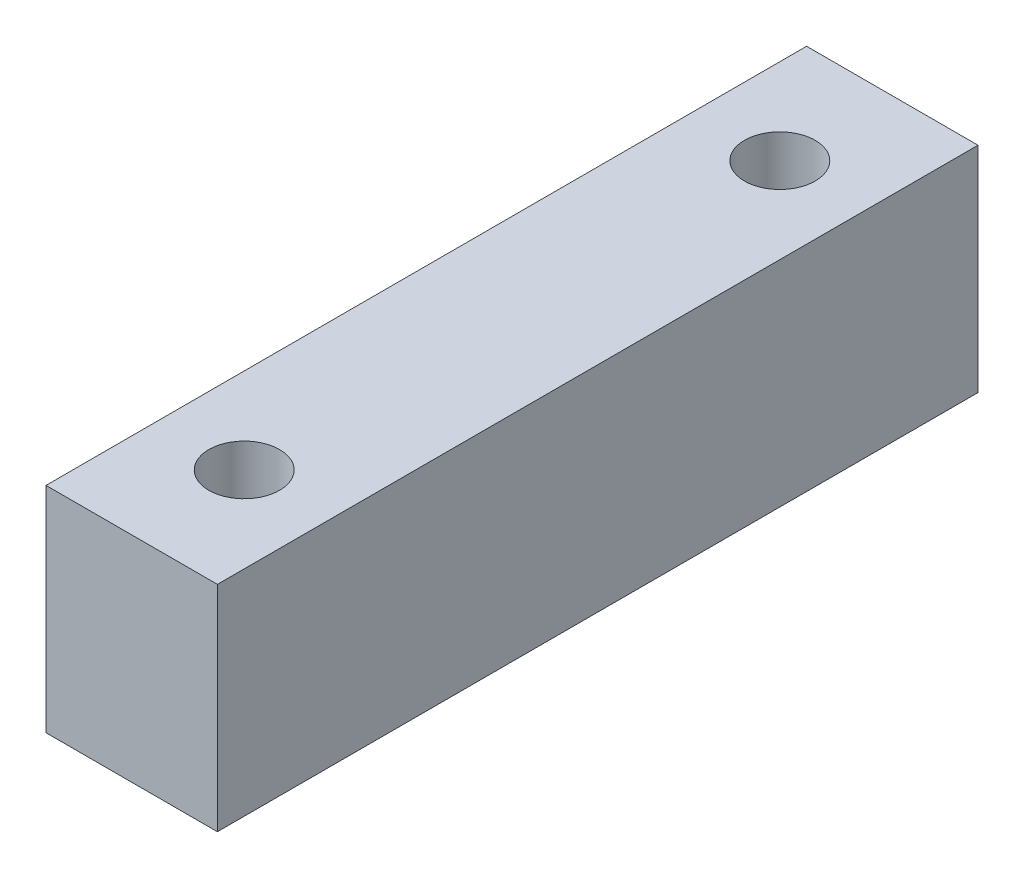
ISO-10303-21;
HEADER;
FILE_DESCRIPTION(('STEP AP214'),'2;1');
FILE_NAME('part.step','',(''),(''),'','','');
FILE_SCHEMA(('AUTOMOTIVE_DESIGN { 1 0 10303 214 1 1 1 1 }'));
ENDSEC;
DATA;
#1=APPLICATION_CONTEXT('core data for automotive mechanical design processes');
#2=APPLICATION_PROTOCOL_DEFINITION('international standard','automotive_design',2000,#1);
#3=PRODUCT_CONTEXT('',#1,'mechanical');
#4=PRODUCT('Part','Part','',(#3));
#5=PRODUCT_RELATED_PRODUCT_CATEGORY('part','',(#4));
#6=PRODUCT_DEFINITION_FORMATION('','',#4);
#7=PRODUCT_DEFINITION_CONTEXT('part definition',#1,'design');
#8=PRODUCT_DEFINITION('design','',#6,#7);
#9=PRODUCT_DEFINITION_SHAPE('','',#8);
#10=(LENGTH_UNIT() NAMED_UNIT(*) SI_UNIT(.MILLI.,.METRE.));
#11=(NAMED_UNIT(*) PLANE_ANGLE_UNIT() SI_UNIT($,.RADIAN.));
#12=(NAMED_UNIT(*) SI_UNIT($,.STERADIAN.) SOLID_ANGLE_UNIT());
#13=UNCERTAINTY_MEASURE_WITH_UNIT(LENGTH_MEASURE(1.E-05),#10,'distance_accuracy_value','');
#14=(GEOMETRIC_REPRESENTATION_CONTEXT(3) GLOBAL_UNCERTAINTY_ASSIGNED_CONTEXT((#13)) GLOBAL_UNIT_ASSIGNED_CONTEXT((#10,
#11,#12)) REPRESENTATION_CONTEXT('',''));
#15=CARTESIAN_POINT('',(0.,0.,0.));
#16=DIRECTION('',(0.,0.,1.));
#17=DIRECTION('',(1.,0.,0.));
#18=AXIS2_PLACEMENT_3D('',#15,#16,#17);
#19=CARTESIAN_POINT('',(4.,10.,-17.75));
#20=DIRECTION('',(-1.,0.,0.));
#21=DIRECTION('',(0.,0.,1.));
#22=AXIS2_PLACEMENT_3D('',#19,#20,#21);
#23=PLANE('',#22);
#24=DIRECTION('',(0.,0.,-1.));
#25=VECTOR('',#24,1.);
#26=CARTESIAN_POINT('',(4.,0.,-17.75));
#27=LINE('',#26,#25);
#28=CARTESIAN_POINT('',(4.,0.,17.75));
#29=VERTEX_POINT('',#28);
#30=CARTESIAN_POINT('',(4.,0.,-17.75));
#31=VERTEX_POINT('',#30);
#32=EDGE_CURVE('E103',#29,#31,#27,.T.);
#33=ORIENTED_EDGE('',*,*,#32,.T.);
#34=DIRECTION('',(0.,-1.,0.));
#35=VECTOR('',#34,1.);
#36=CARTESIAN_POINT('',(4.,10.,-17.75));
#37=LINE('',#36,#35);
#38=CARTESIAN_POINT('',(4.,10.,-17.75));
#39=VERTEX_POINT('',#38);
#40=EDGE_CURVE('E12',#39,#31,#37,.T.);
#41=ORIENTED_EDGE('',*,*,#40,.F.);
#42=DIRECTION('',(0.,0.,-1.));
#43=VECTOR('',#42,1.);
#44=CARTESIAN_POINT('',(4.,10.,-17.75));
#45=LINE('',#44,#43);
#46=CARTESIAN_POINT('',(4.,10.,17.75));
#47=VERTEX_POINT('',#46);
#48=EDGE_CURVE('E90',#47,#39,#45,.T.);
#49=ORIENTED_EDGE('',*,*,#48,.F.);
#50=DIRECTION('',(0.,-1.,0.));
#51=VECTOR('',#50,1.);
#52=CARTESIAN_POINT('',(4.,10.,17.75));
#53=LINE('',#52,#51);
#54=EDGE_CURVE('E99',#47,#29,#53,.T.);
#55=ORIENTED_EDGE('',*,*,#54,.T.);
#56=EDGE_LOOP('',(#33,#41,#49,#55));
#57=FACE_BOUND('',#56,.T.);
#58=ADVANCED_FACE('F37',(#57),#23,.F.);
#59=CARTESIAN_POINT('',(-4.,10.,-17.75));
#60=DIRECTION('',(0.,0.,1.));
#61=DIRECTION('',(1.,0.,0.));
#62=AXIS2_PLACEMENT_3D('',#59,#60,#61);
#63=PLANE('',#62);
#64=DIRECTION('',(-1.,0.,0.));
#65=VECTOR('',#64,1.);
#66=CARTESIAN_POINT('',(-4.,0.,-17.75));
#67=LINE('',#66,#65);
#68=CARTESIAN_POINT('',(-4.,0.,-17.75));
#69=VERTEX_POINT('',#68);
#70=EDGE_CURVE('E94',#31,#69,#67,.T.);
#71=ORIENTED_EDGE('',*,*,#70,.T.);
#72=DIRECTION('',(0.,-1.,0.));
#73=VECTOR('',#72,1.);
#74=CARTESIAN_POINT('',(-4.,10.,-17.75));
#75=LINE('',#74,#73);
#76=CARTESIAN_POINT('',(-4.,10.,-17.75));
#77=VERTEX_POINT('',#76);
#78=EDGE_CURVE('E46',#77,#69,#75,.T.);
#79=ORIENTED_EDGE('',*,*,#78,.F.);
#80=DIRECTION('',(-1.,0.,0.));
#81=VECTOR('',#80,1.);
#82=CARTESIAN_POINT('',(-4.,10.,-17.75));
#83=LINE('',#82,#81);
#84=EDGE_CURVE('E85',#39,#77,#83,.T.);
#85=ORIENTED_EDGE('',*,*,#84,.F.);
#86=ORIENTED_EDGE('',*,*,#40,.T.);
#87=EDGE_LOOP('',(#71,#79,#85,#86));
#88=FACE_BOUND('',#87,.T.);
#89=ADVANCED_FACE('F93',(#88),#63,.F.);
#90=CARTESIAN_POINT('',(-4.,10.,-17.75));
#91=DIRECTION('',(1.,0.,0.));
#92=DIRECTION('',(0.,0.,-1.));
#93=AXIS2_PLACEMENT_3D('',#90,#91,#92);
#94=PLANE('',#93);
#95=DIRECTION('',(0.,0.,1.));
#96=VECTOR('',#95,1.);
#97=CARTESIAN_POINT('',(-4.,0.,-17.75));
#98=LINE('',#97,#96);
#99=CARTESIAN_POINT('',(-4.,0.,17.75));
#100=VERTEX_POINT('',#99);
#101=EDGE_CURVE('E72',#69,#100,#98,.T.);
#102=ORIENTED_EDGE('',*,*,#101,.T.);
#103=DIRECTION('',(0.,-1.,0.));
#104=VECTOR('',#103,1.);
#105=CARTESIAN_POINT('',(-4.,10.,17.75));
#106=LINE('',#105,#104);
#107=CARTESIAN_POINT('',(-4.,10.,17.75));
#108=VERTEX_POINT('',#107);
#109=EDGE_CURVE('E95',#108,#100,#106,.T.);
#110=ORIENTED_EDGE('',*,*,#109,.F.);
#111=DIRECTION('',(0.,0.,1.));
#112=VECTOR('',#111,1.);
#113=CARTESIAN_POINT('',(-4.,10.,-17.75));
#114=LINE('',#113,#112);
#115=EDGE_CURVE('E88',#77,#108,#114,.T.);
#116=ORIENTED_EDGE('',*,*,#115,.F.);
#117=ORIENTED_EDGE('',*,*,#78,.T.);
#118=EDGE_LOOP('',(#102,#110,#116,#117));
#119=FACE_BOUND('',#118,.T.);
#120=ADVANCED_FACE('F97',(#119),#94,.F.);
#121=CARTESIAN_POINT('',(-4.,10.,17.75));
#122=DIRECTION('',(0.,0.,-1.));
#123=DIRECTION('',(-1.,0.,0.));
#124=AXIS2_PLACEMENT_3D('',#121,#122,#123);
#125=PLANE('',#124);
#126=DIRECTION('',(1.,0.,0.));
#127=VECTOR('',#126,1.);
#128=CARTESIAN_POINT('',(-4.,0.,17.75));
#129=LINE('',#128,#127);
#130=EDGE_CURVE('E78',#100,#29,#129,.T.);
#131=ORIENTED_EDGE('',*,*,#130,.T.);
#132=ORIENTED_EDGE('',*,*,#54,.F.);
#133=DIRECTION('',(1.,0.,0.));
#134=VECTOR('',#133,1.);
#135=CARTESIAN_POINT('',(-4.,10.,17.75));
#136=LINE('',#135,#134);
#137=EDGE_CURVE('E55',#108,#47,#136,.T.);
#138=ORIENTED_EDGE('',*,*,#137,.F.);
#139=ORIENTED_EDGE('',*,*,#109,.T.);
#140=EDGE_LOOP('',(#131,#132,#138,#139));
#141=FACE_BOUND('',#140,.T.);
#142=ADVANCED_FACE('F141',(#141),#125,.F.);
#143=CARTESIAN_POINT('',(0.,10.,0.));
#144=DIRECTION('',(0.,1.,0.));
#145=DIRECTION('',(0.,0.,1.));
#146=AXIS2_PLACEMENT_3D('',#143,#144,#145);
#147=PLANE('',#146);
#148=CARTESIAN_POINT('',(0.,10.,-12.5));
#149=DIRECTION('',(0.,1.,0.));
#150=DIRECTION('',(0.,0.,1.));
#151=AXIS2_PLACEMENT_3D('',#148,#149,#150);
#152=CIRCLE('',#151,1.65);
#153=CARTESIAN_POINT('',(0.,10.,-10.85));
#154=VERTEX_POINT('',#153);
#155=EDGE_CURVE('E106',#154,#154,#152,.T.);
#156=ORIENTED_EDGE('',*,*,#155,.F.);
#157=EDGE_LOOP('',(#156));
#158=FACE_BOUND('',#157,.T.);
#159=CARTESIAN_POINT('',(0.,10.,12.5));
#160=DIRECTION('',(0.,1.,0.));
#161=DIRECTION('',(0.,0.,1.));
#162=AXIS2_PLACEMENT_3D('',#159,#160,#161);
#163=CIRCLE('',#162,1.65);
#164=CARTESIAN_POINT('',(0.,10.,14.15));
#165=VERTEX_POINT('',#164);
#166=EDGE_CURVE('E117',#165,#165,#163,.T.);
#167=ORIENTED_EDGE('',*,*,#166,.F.);
#168=EDGE_LOOP('',(#167));
#169=FACE_BOUND('',#168,.T.);
#170=ORIENTED_EDGE('',*,*,#48,.T.);
#171=ORIENTED_EDGE('',*,*,#84,.T.);
#172=ORIENTED_EDGE('',*,*,#115,.T.);
#173=ORIENTED_EDGE('',*,*,#137,.T.);
#174=EDGE_LOOP('',(#170,#171,#172,#173));
#175=FACE_BOUND('',#174,.T.);
#176=ADVANCED_FACE('F86',(#158,#169,#175),#147,.T.);
#177=CARTESIAN_POINT('',(0.,0.,0.));
#178=DIRECTION('',(0.,1.,0.));
#179=DIRECTION('',(0.,0.,1.));
#180=AXIS2_PLACEMENT_3D('',#177,#178,#179);
#181=PLANE('',#180);
#182=CARTESIAN_POINT('',(0.,0.,-12.5));
#183=DIRECTION('',(0.,1.,0.));
#184=DIRECTION('',(0.,0.,1.));
#185=AXIS2_PLACEMENT_3D('',#182,#183,#184);
#186=CIRCLE('',#185,3.);
#187=CARTESIAN_POINT('',(0.,0.,-9.5));
#188=VERTEX_POINT('',#187);
#189=EDGE_CURVE('E119',#188,#188,#186,.T.);
#190=ORIENTED_EDGE('',*,*,#189,.T.);
#191=EDGE_LOOP('',(#190));
#192=FACE_BOUND('',#191,.T.);
#193=CARTESIAN_POINT('',(0.,0.,12.5));
#194=DIRECTION('',(0.,1.,0.));
#195=DIRECTION('',(0.,0.,1.));
#196=AXIS2_PLACEMENT_3D('',#193,#194,#195);
#197=CIRCLE('',#196,3.);
#198=CARTESIAN_POINT('',(0.,0.,15.5));
#199=VERTEX_POINT('',#198);
#200=EDGE_CURVE('E127',#199,#199,#197,.T.);
#201=ORIENTED_EDGE('',*,*,#200,.T.);
#202=EDGE_LOOP('',(#201));
#203=FACE_BOUND('',#202,.T.);
#204=ORIENTED_EDGE('',*,*,#32,.F.);
#205=ORIENTED_EDGE('',*,*,#130,.F.);
#206=ORIENTED_EDGE('',*,*,#101,.F.);
#207=ORIENTED_EDGE('',*,*,#70,.F.);
#208=EDGE_LOOP('',(#204,#205,#206,#207));
#209=FACE_BOUND('',#208,.T.);
#210=ADVANCED_FACE('F140',(#192,#203,#209),#181,.F.);
#211=CARTESIAN_POINT('',(0.,-0.000999999999999265,12.5));
#212=DIRECTION('',(0.,1.,0.));
#213=DIRECTION('',(0.,0.,1.));
#214=AXIS2_PLACEMENT_3D('',#211,#212,#213);
#215=CYLINDRICAL_SURFACE('',#214,1.65);
#216=CARTESIAN_POINT('',(0.,7.,12.5));
#217=DIRECTION('',(0.,1.,0.));
#218=DIRECTION('',(0.,0.,1.));
#219=AXIS2_PLACEMENT_3D('',#216,#217,#218);
#220=CIRCLE('',#219,1.65);
#221=CARTESIAN_POINT('',(0.,7.,14.15));
#222=VERTEX_POINT('',#221);
#223=EDGE_CURVE('E40',#222,#222,#220,.F.);
#224=ORIENTED_EDGE('',*,*,#223,.T.);
#225=EDGE_LOOP('',(#224));
#226=FACE_BOUND('',#225,.T.);
#227=ORIENTED_EDGE('',*,*,#166,.T.);
#228=EDGE_LOOP('',(#227));
#229=FACE_BOUND('',#228,.T.);
#230=ADVANCED_FACE('F137',(#226,#229),#215,.F.);
#231=CARTESIAN_POINT('',(0.,-0.000999999999999265,-12.5));
#232=DIRECTION('',(0.,1.,0.));
#233=DIRECTION('',(0.,0.,1.));
#234=AXIS2_PLACEMENT_3D('',#231,#232,#233);
#235=CYLINDRICAL_SURFACE('',#234,1.65);
#236=CARTESIAN_POINT('',(0.,7.,-12.5));
#237=DIRECTION('',(0.,1.,0.));
#238=DIRECTION('',(0.,0.,1.));
#239=AXIS2_PLACEMENT_3D('',#236,#237,#238);
#240=CIRCLE('',#239,1.65);
#241=CARTESIAN_POINT('',(0.,7.,-10.85));
#242=VERTEX_POINT('',#241);
#243=EDGE_CURVE('E111',#242,#242,#240,.F.);
#244=ORIENTED_EDGE('',*,*,#243,.T.);
#245=EDGE_LOOP('',(#244));
#246=FACE_BOUND('',#245,.T.);
#247=ORIENTED_EDGE('',*,*,#155,.T.);
#248=EDGE_LOOP('',(#247));
#249=FACE_BOUND('',#248,.T.);
#250=ADVANCED_FACE('F186',(#246,#249),#235,.F.);
#251=CARTESIAN_POINT('',(0.,7.,0.));
#252=DIRECTION('',(0.,1.,0.));
#253=DIRECTION('',(0.,0.,1.));
#254=AXIS2_PLACEMENT_3D('',#251,#252,#253);
#255=PLANE('',#254);
#256=CARTESIAN_POINT('',(0.,7.,-12.5));
#257=DIRECTION('',(0.,1.,0.));
#258=DIRECTION('',(0.,0.,1.));
#259=AXIS2_PLACEMENT_3D('',#256,#257,#258);
#260=CIRCLE('',#259,3.);
#261=CARTESIAN_POINT('',(0.,7.,-9.5));
#262=VERTEX_POINT('',#261);
#263=EDGE_CURVE('E113',#262,#262,#260,.T.);
#264=ORIENTED_EDGE('',*,*,#263,.F.);
#265=EDGE_LOOP('',(#264));
#266=FACE_BOUND('',#265,.T.);
#267=ORIENTED_EDGE('',*,*,#243,.F.);
#268=EDGE_LOOP('',(#267));
#269=FACE_BOUND('',#268,.T.);
#270=ADVANCED_FACE('F193',(#266,#269),#255,.F.);
#271=CARTESIAN_POINT('',(0.,18.4852813742386,-12.5));
#272=DIRECTION('',(0.,-1.,0.));
#273=DIRECTION('',(0.,0.,-1.));
#274=AXIS2_PLACEMENT_3D('',#271,#272,#273);
#275=CYLINDRICAL_SURFACE('',#274,3.);
#276=ORIENTED_EDGE('',*,*,#189,.F.);
#277=EDGE_LOOP('',(#276));
#278=FACE_BOUND('',#277,.T.);
#279=ORIENTED_EDGE('',*,*,#263,.T.);
#280=EDGE_LOOP('',(#279));
#281=FACE_BOUND('',#280,.T.);
#282=ADVANCED_FACE('F201',(#278,#281),#275,.F.);
#283=CARTESIAN_POINT('',(0.,7.,0.));
#284=DIRECTION('',(0.,1.,0.));
#285=DIRECTION('',(0.,0.,1.));
#286=AXIS2_PLACEMENT_3D('',#283,#284,#285);
#287=PLANE('',#286);
#288=CARTESIAN_POINT('',(0.,7.,12.5));
#289=DIRECTION('',(0.,1.,0.));
#290=DIRECTION('',(0.,0.,1.));
#291=AXIS2_PLACEMENT_3D('',#288,#289,#290);
#292=CIRCLE('',#291,3.);
#293=CARTESIAN_POINT('',(0.,7.,15.5));
#294=VERTEX_POINT('',#293);
#295=EDGE_CURVE('E124',#294,#294,#292,.T.);
#296=ORIENTED_EDGE('',*,*,#295,.F.);
#297=EDGE_LOOP('',(#296));
#298=FACE_BOUND('',#297,.T.);
#299=ORIENTED_EDGE('',*,*,#223,.F.);
#300=EDGE_LOOP('',(#299));
#301=FACE_BOUND('',#300,.T.);
#302=ADVANCED_FACE('F211',(#298,#301),#287,.F.);
#303=CARTESIAN_POINT('',(0.,18.4852813742386,12.5));
#304=DIRECTION('',(0.,-1.,0.));
#305=DIRECTION('',(0.,0.,-1.));
#306=AXIS2_PLACEMENT_3D('',#303,#304,#305);
#307=CYLINDRICAL_SURFACE('',#306,3.);
#308=ORIENTED_EDGE('',*,*,#200,.F.);
#309=EDGE_LOOP('',(#308));
#310=FACE_BOUND('',#309,.T.);
#311=ORIENTED_EDGE('',*,*,#295,.T.);
#312=EDGE_LOOP('',(#311));
#313=FACE_BOUND('',#312,.T.);
#314=ADVANCED_FACE('F221',(#310,#313),#307,.F.);
#315=CLOSED_SHELL('',(#58,#89,#120,#142,#176,#210,#230,#250,#270,#282,#302,#314));
#316=MANIFOLD_SOLID_BREP('B2',#315);
#317=ADVANCED_BREP_SHAPE_REPRESENTATION('',(#18,#316),#14);
#318=SHAPE_DEFINITION_REPRESENTATION(#9,#317);
ENDSEC;
END-ISO-10303-21;
